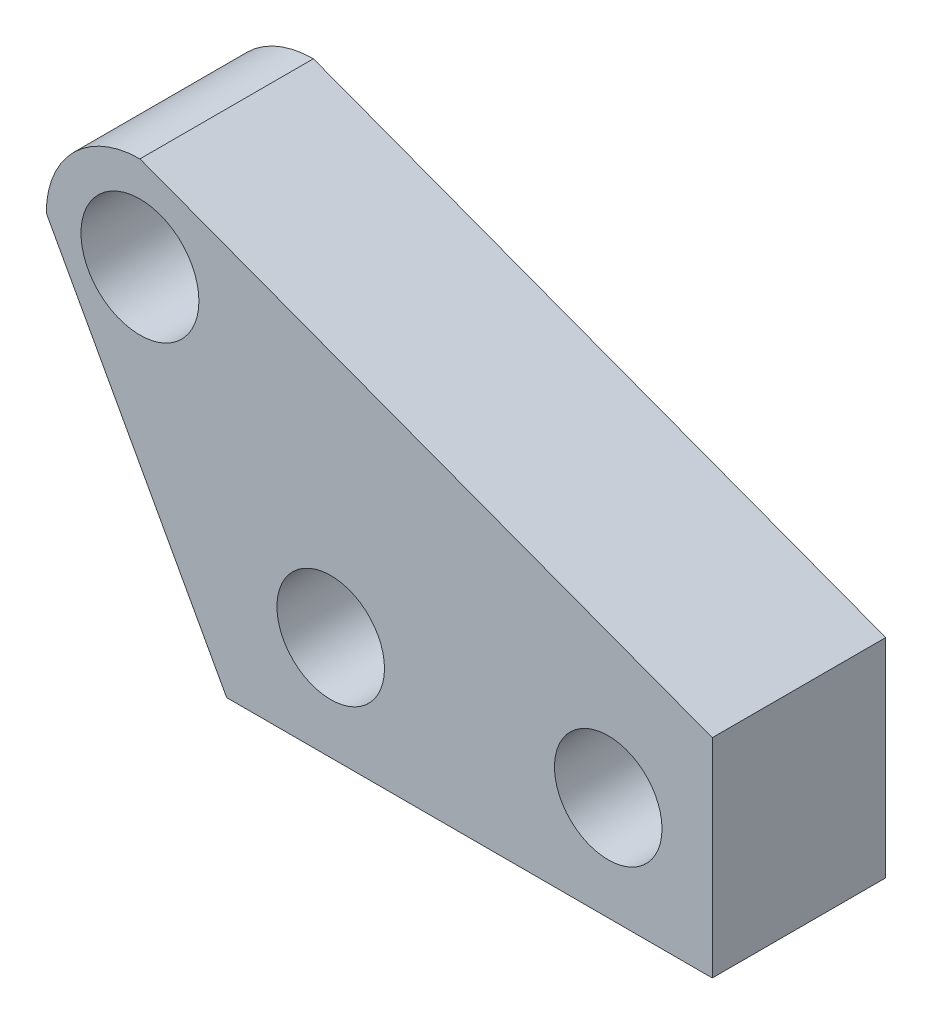
ISO-10303-21;
HEADER;
FILE_DESCRIPTION(('STEP AP214'),'2;1');
FILE_NAME('part.step','',(''),(''),'','','');
FILE_SCHEMA(('AUTOMOTIVE_DESIGN { 1 0 10303 214 1 1 1 1 }'));
ENDSEC;
DATA;
#1=APPLICATION_CONTEXT('core data for automotive mechanical design processes');
#2=APPLICATION_PROTOCOL_DEFINITION('international standard','automotive_design',2000,#1);
#3=PRODUCT_CONTEXT('',#1,'mechanical');
#4=PRODUCT('Part','Part','',(#3));
#5=PRODUCT_RELATED_PRODUCT_CATEGORY('part','',(#4));
#6=PRODUCT_DEFINITION_FORMATION('','',#4);
#7=PRODUCT_DEFINITION_CONTEXT('part definition',#1,'design');
#8=PRODUCT_DEFINITION('design','',#6,#7);
#9=PRODUCT_DEFINITION_SHAPE('','',#8);
#10=(LENGTH_UNIT() NAMED_UNIT(*) SI_UNIT(.MILLI.,.METRE.));
#11=(NAMED_UNIT(*) PLANE_ANGLE_UNIT() SI_UNIT($,.RADIAN.));
#12=(NAMED_UNIT(*) SI_UNIT($,.STERADIAN.) SOLID_ANGLE_UNIT());
#13=UNCERTAINTY_MEASURE_WITH_UNIT(LENGTH_MEASURE(1.E-05),#10,'distance_accuracy_value','');
#14=(GEOMETRIC_REPRESENTATION_CONTEXT(3) GLOBAL_UNCERTAINTY_ASSIGNED_CONTEXT((#13)) GLOBAL_UNIT_ASSIGNED_CONTEXT((#10,
#11,#12)) REPRESENTATION_CONTEXT('',''));
#15=CARTESIAN_POINT('',(0.,0.,0.));
#16=DIRECTION('',(0.,0.,1.));
#17=DIRECTION('',(1.,0.,0.));
#18=AXIS2_PLACEMENT_3D('',#15,#16,#17);
#19=CARTESIAN_POINT('',(7.,0.,5.));
#20=DIRECTION('',(-1.,0.,0.));
#21=DIRECTION('',(0.,0.,1.));
#22=AXIS2_PLACEMENT_3D('',#19,#20,#21);
#23=PLANE('',#22);
#24=DIRECTION('',(0.,1.,0.));
#25=VECTOR('',#24,1.);
#26=CARTESIAN_POINT('',(7.,0.,0.));
#27=LINE('',#26,#25);
#28=CARTESIAN_POINT('',(7.,-3.,0.));
#29=VERTEX_POINT('',#28);
#30=CARTESIAN_POINT('',(7.,3.,0.));
#31=VERTEX_POINT('',#30);
#32=EDGE_CURVE('E121',#29,#31,#27,.T.);
#33=ORIENTED_EDGE('',*,*,#32,.T.);
#34=DIRECTION('',(0.,0.,-1.));
#35=VECTOR('',#34,1.);
#36=CARTESIAN_POINT('',(7.,3.,5.));
#37=LINE('',#36,#35);
#38=CARTESIAN_POINT('',(7.,3.,5.));
#39=VERTEX_POINT('',#38);
#40=EDGE_CURVE('E11',#39,#31,#37,.T.);
#41=ORIENTED_EDGE('',*,*,#40,.F.);
#42=DIRECTION('',(0.,1.,0.));
#43=VECTOR('',#42,1.);
#44=CARTESIAN_POINT('',(7.,0.,5.));
#45=LINE('',#44,#43);
#46=CARTESIAN_POINT('',(7.,-3.,5.));
#47=VERTEX_POINT('',#46);
#48=EDGE_CURVE('E84',#47,#39,#45,.T.);
#49=ORIENTED_EDGE('',*,*,#48,.F.);
#50=DIRECTION('',(0.,0.,-1.));
#51=VECTOR('',#50,1.);
#52=CARTESIAN_POINT('',(7.,-3.,5.));
#53=LINE('',#52,#51);
#54=EDGE_CURVE('E120',#47,#29,#53,.T.);
#55=ORIENTED_EDGE('',*,*,#54,.T.);
#56=EDGE_LOOP('',(#33,#41,#49,#55));
#57=FACE_BOUND('',#56,.T.);
#58=ADVANCED_FACE('F37',(#57),#23,.F.);
#59=CARTESIAN_POINT('',(1.85387363610029,4.9336959670411,5.));
#60=DIRECTION('',(0.351745096566042,0.936095821506402,0.));
#61=DIRECTION('',(-0.936095821506402,0.351745096566042,0.));
#62=AXIS2_PLACEMENT_3D('',#59,#60,#61);
#63=PLANE('',#62);
#64=DIRECTION('',(0.936095821506402,-0.351745096566042,0.));
#65=VECTOR('',#64,1.);
#66=CARTESIAN_POINT('',(1.85387363610029,4.9336959670411,0.));
#67=LINE('',#66,#65);
#68=CARTESIAN_POINT('',(-9.5,9.2,0.));
#69=VERTEX_POINT('',#68);
#70=EDGE_CURVE('E124',#69,#31,#67,.T.);
#71=ORIENTED_EDGE('',*,*,#70,.F.);
#72=DIRECTION('',(0.,0.,-1.));
#73=VECTOR('',#72,1.);
#74=CARTESIAN_POINT('',(-9.5,9.2,5.));
#75=LINE('',#74,#73);
#76=CARTESIAN_POINT('',(-9.5,9.2,5.));
#77=VERTEX_POINT('',#76);
#78=EDGE_CURVE('E45',#77,#69,#75,.T.);
#79=ORIENTED_EDGE('',*,*,#78,.F.);
#80=DIRECTION('',(0.936095821506402,-0.351745096566042,0.));
#81=VECTOR('',#80,1.);
#82=CARTESIAN_POINT('',(1.85387363610029,4.9336959670411,5.));
#83=LINE('',#82,#81);
#84=EDGE_CURVE('E97',#77,#39,#83,.T.);
#85=ORIENTED_EDGE('',*,*,#84,.T.);
#86=ORIENTED_EDGE('',*,*,#40,.T.);
#87=EDGE_LOOP('',(#71,#79,#85,#86));
#88=FACE_BOUND('',#87,.T.);
#89=ADVANCED_FACE('F146',(#88),#63,.T.);
#90=CARTESIAN_POINT('',(-9.5,6.5,5.));
#91=DIRECTION('',(0.,0.,-1.));
#92=DIRECTION('',(-1.,0.,0.));
#93=AXIS2_PLACEMENT_3D('',#90,#91,#92);
#94=CYLINDRICAL_SURFACE('',#93,2.7);
#95=CARTESIAN_POINT('',(-9.5,6.5,0.));
#96=DIRECTION('',(0.,0.,1.));
#97=DIRECTION('',(1.,0.,0.));
#98=AXIS2_PLACEMENT_3D('',#95,#96,#97);
#99=CIRCLE('',#98,2.7);
#100=CARTESIAN_POINT('',(-12.2,6.5,0.));
#101=VERTEX_POINT('',#100);
#102=EDGE_CURVE('E103',#69,#101,#99,.T.);
#103=ORIENTED_EDGE('',*,*,#102,.T.);
#104=DIRECTION('',(0.,0.,-1.));
#105=VECTOR('',#104,1.);
#106=CARTESIAN_POINT('',(-12.2,6.5,5.));
#107=LINE('',#106,#105);
#108=CARTESIAN_POINT('',(-12.2,6.5,5.));
#109=VERTEX_POINT('',#108);
#110=EDGE_CURVE('E100',#109,#101,#107,.T.);
#111=ORIENTED_EDGE('',*,*,#110,.F.);
#112=CARTESIAN_POINT('',(-9.5,6.5,5.));
#113=DIRECTION('',(0.,0.,1.));
#114=DIRECTION('',(1.,0.,0.));
#115=AXIS2_PLACEMENT_3D('',#112,#113,#114);
#116=CIRCLE('',#115,2.7);
#117=EDGE_CURVE('E90',#77,#109,#116,.T.);
#118=ORIENTED_EDGE('',*,*,#117,.F.);
#119=ORIENTED_EDGE('',*,*,#78,.T.);
#120=EDGE_LOOP('',(#103,#111,#118,#119));
#121=FACE_BOUND('',#120,.T.);
#122=ADVANCED_FACE('F101',(#121),#94,.T.);
#123=CARTESIAN_POINT('',(-6.64975701253304,-3.63986699633387,5.));
#124=DIRECTION('',(0.877188869085252,0.480145486236138,0.));
#125=DIRECTION('',(-0.480145486236138,0.877188869085252,0.));
#126=AXIS2_PLACEMENT_3D('',#123,#124,#125);
#127=PLANE('',#126);
#128=DIRECTION('',(0.480145486236138,-0.877188869085252,0.));
#129=VECTOR('',#128,1.);
#130=CARTESIAN_POINT('',(-6.64975701253304,-3.63986699633387,0.));
#131=LINE('',#130,#129);
#132=CARTESIAN_POINT('',(-7.,-3.,0.));
#133=VERTEX_POINT('',#132);
#134=EDGE_CURVE('E72',#101,#133,#131,.T.);
#135=ORIENTED_EDGE('',*,*,#134,.T.);
#136=DIRECTION('',(0.,0.,-1.));
#137=VECTOR('',#136,1.);
#138=CARTESIAN_POINT('',(-7.,-3.,5.));
#139=LINE('',#138,#137);
#140=CARTESIAN_POINT('',(-7.,-3.,5.));
#141=VERTEX_POINT('',#140);
#142=EDGE_CURVE('E104',#141,#133,#139,.T.);
#143=ORIENTED_EDGE('',*,*,#142,.F.);
#144=DIRECTION('',(0.480145486236138,-0.877188869085252,0.));
#145=VECTOR('',#144,1.);
#146=CARTESIAN_POINT('',(-6.64975701253304,-3.63986699633387,5.));
#147=LINE('',#146,#145);
#148=EDGE_CURVE('E95',#109,#141,#147,.T.);
#149=ORIENTED_EDGE('',*,*,#148,.F.);
#150=ORIENTED_EDGE('',*,*,#110,.T.);
#151=EDGE_LOOP('',(#135,#143,#149,#150));
#152=FACE_BOUND('',#151,.T.);
#153=ADVANCED_FACE('F106',(#152),#127,.F.);
#154=CARTESIAN_POINT('',(-4.,0.,5.));
#155=DIRECTION('',(0.,0.,-1.));
#156=DIRECTION('',(-1.,0.,0.));
#157=AXIS2_PLACEMENT_3D('',#154,#155,#156);
#158=CYLINDRICAL_SURFACE('',#157,1.55);
#159=CARTESIAN_POINT('',(-4.,0.,5.));
#160=DIRECTION('',(0.,0.,1.));
#161=DIRECTION('',(1.,0.,0.));
#162=AXIS2_PLACEMENT_3D('',#159,#160,#161);
#163=CIRCLE('',#162,1.55);
#164=CARTESIAN_POINT('',(-2.45,0.,5.));
#165=VERTEX_POINT('',#164);
#166=EDGE_CURVE('E114',#165,#165,#163,.T.);
#167=ORIENTED_EDGE('',*,*,#166,.T.);
#168=EDGE_LOOP('',(#167));
#169=FACE_BOUND('',#168,.T.);
#170=CARTESIAN_POINT('',(-4.,0.,0.));
#171=DIRECTION('',(0.,0.,1.));
#172=DIRECTION('',(1.,0.,0.));
#173=AXIS2_PLACEMENT_3D('',#170,#171,#172);
#174=CIRCLE('',#173,1.55);
#175=CARTESIAN_POINT('',(-2.45,0.,0.));
#176=VERTEX_POINT('',#175);
#177=EDGE_CURVE('E133',#176,#176,#174,.T.);
#178=ORIENTED_EDGE('',*,*,#177,.F.);
#179=EDGE_LOOP('',(#178));
#180=FACE_BOUND('',#179,.T.);
#181=ADVANCED_FACE('F159',(#169,#180),#158,.F.);
#182=CARTESIAN_POINT('',(4.,0.,5.));
#183=DIRECTION('',(0.,0.,-1.));
#184=DIRECTION('',(-1.,0.,0.));
#185=AXIS2_PLACEMENT_3D('',#182,#183,#184);
#186=CYLINDRICAL_SURFACE('',#185,1.55);
#187=CARTESIAN_POINT('',(4.,0.,5.));
#188=DIRECTION('',(0.,0.,1.));
#189=DIRECTION('',(1.,0.,0.));
#190=AXIS2_PLACEMENT_3D('',#187,#188,#189);
#191=CIRCLE('',#190,1.55);
#192=CARTESIAN_POINT('',(5.55,0.,5.));
#193=VERTEX_POINT('',#192);
#194=EDGE_CURVE('E108',#193,#193,#191,.T.);
#195=ORIENTED_EDGE('',*,*,#194,.T.);
#196=EDGE_LOOP('',(#195));
#197=FACE_BOUND('',#196,.T.);
#198=CARTESIAN_POINT('',(4.,0.,0.));
#199=DIRECTION('',(0.,0.,1.));
#200=DIRECTION('',(1.,0.,0.));
#201=AXIS2_PLACEMENT_3D('',#198,#199,#200);
#202=CIRCLE('',#201,1.55);
#203=CARTESIAN_POINT('',(5.55,0.,0.));
#204=VERTEX_POINT('',#203);
#205=EDGE_CURVE('E130',#204,#204,#202,.T.);
#206=ORIENTED_EDGE('',*,*,#205,.F.);
#207=EDGE_LOOP('',(#206));
#208=FACE_BOUND('',#207,.T.);
#209=ADVANCED_FACE('F151',(#197,#208),#186,.F.);
#210=CARTESIAN_POINT('',(0.,-3.,5.));
#211=DIRECTION('',(0.,1.,0.));
#212=DIRECTION('',(0.,0.,1.));
#213=AXIS2_PLACEMENT_3D('',#210,#211,#212);
#214=PLANE('',#213);
#215=DIRECTION('',(1.,0.,0.));
#216=VECTOR('',#215,1.);
#217=CARTESIAN_POINT('',(0.,-3.,0.));
#218=LINE('',#217,#216);
#219=EDGE_CURVE('E78',#133,#29,#218,.T.);
#220=ORIENTED_EDGE('',*,*,#219,.T.);
#221=ORIENTED_EDGE('',*,*,#54,.F.);
#222=DIRECTION('',(1.,0.,0.));
#223=VECTOR('',#222,1.);
#224=CARTESIAN_POINT('',(0.,-3.,5.));
#225=LINE('',#224,#223);
#226=EDGE_CURVE('E53',#141,#47,#225,.T.);
#227=ORIENTED_EDGE('',*,*,#226,.F.);
#228=ORIENTED_EDGE('',*,*,#142,.T.);
#229=EDGE_LOOP('',(#220,#221,#227,#228));
#230=FACE_BOUND('',#229,.T.);
#231=ADVANCED_FACE('F148',(#230),#214,.F.);
#232=CARTESIAN_POINT('',(-9.5,6.5,5.));
#233=DIRECTION('',(0.,0.,-1.));
#234=DIRECTION('',(-1.,0.,0.));
#235=AXIS2_PLACEMENT_3D('',#232,#233,#234);
#236=CYLINDRICAL_SURFACE('',#235,1.7);
#237=CARTESIAN_POINT('',(-9.5,6.5,5.));
#238=DIRECTION('',(0.,0.,1.));
#239=DIRECTION('',(1.,0.,0.));
#240=AXIS2_PLACEMENT_3D('',#237,#238,#239);
#241=CIRCLE('',#240,1.7);
#242=CARTESIAN_POINT('',(-7.8,6.5,5.));
#243=VERTEX_POINT('',#242);
#244=EDGE_CURVE('E117',#243,#243,#241,.T.);
#245=ORIENTED_EDGE('',*,*,#244,.T.);
#246=EDGE_LOOP('',(#245));
#247=FACE_BOUND('',#246,.T.);
#248=CARTESIAN_POINT('',(-9.5,6.5,0.));
#249=DIRECTION('',(0.,0.,1.));
#250=DIRECTION('',(1.,0.,0.));
#251=AXIS2_PLACEMENT_3D('',#248,#249,#250);
#252=CIRCLE('',#251,1.7);
#253=CARTESIAN_POINT('',(-7.8,6.5,0.));
#254=VERTEX_POINT('',#253);
#255=EDGE_CURVE('E136',#254,#254,#252,.T.);
#256=ORIENTED_EDGE('',*,*,#255,.F.);
#257=EDGE_LOOP('',(#256));
#258=FACE_BOUND('',#257,.T.);
#259=ADVANCED_FACE('F150',(#247,#258),#236,.F.);
#260=CARTESIAN_POINT('',(0.,0.,5.));
#261=DIRECTION('',(0.,0.,1.));
#262=DIRECTION('',(1.,0.,0.));
#263=AXIS2_PLACEMENT_3D('',#260,#261,#262);
#264=PLANE('',#263);
#265=ORIENTED_EDGE('',*,*,#48,.T.);
#266=ORIENTED_EDGE('',*,*,#84,.F.);
#267=ORIENTED_EDGE('',*,*,#117,.T.);
#268=ORIENTED_EDGE('',*,*,#148,.T.);
#269=ORIENTED_EDGE('',*,*,#226,.T.);
#270=EDGE_LOOP('',(#265,#266,#267,#268,#269));
#271=FACE_BOUND('',#270,.T.);
#272=ORIENTED_EDGE('',*,*,#194,.F.);
#273=EDGE_LOOP('',(#272));
#274=FACE_BOUND('',#273,.T.);
#275=ORIENTED_EDGE('',*,*,#166,.F.);
#276=EDGE_LOOP('',(#275));
#277=FACE_BOUND('',#276,.T.);
#278=ORIENTED_EDGE('',*,*,#244,.F.);
#279=EDGE_LOOP('',(#278));
#280=FACE_BOUND('',#279,.T.);
#281=ADVANCED_FACE('F92',(#271,#274,#277,#280),#264,.T.);
#282=CARTESIAN_POINT('',(0.,0.,0.));
#283=DIRECTION('',(0.,0.,1.));
#284=DIRECTION('',(1.,0.,0.));
#285=AXIS2_PLACEMENT_3D('',#282,#283,#284);
#286=PLANE('',#285);
#287=ORIENTED_EDGE('',*,*,#32,.F.);
#288=ORIENTED_EDGE('',*,*,#219,.F.);
#289=ORIENTED_EDGE('',*,*,#134,.F.);
#290=ORIENTED_EDGE('',*,*,#102,.F.);
#291=ORIENTED_EDGE('',*,*,#70,.T.);
#292=EDGE_LOOP('',(#287,#288,#289,#290,#291));
#293=FACE_BOUND('',#292,.T.);
#294=ORIENTED_EDGE('',*,*,#205,.T.);
#295=EDGE_LOOP('',(#294));
#296=FACE_BOUND('',#295,.T.);
#297=ORIENTED_EDGE('',*,*,#177,.T.);
#298=EDGE_LOOP('',(#297));
#299=FACE_BOUND('',#298,.T.);
#300=ORIENTED_EDGE('',*,*,#255,.T.);
#301=EDGE_LOOP('',(#300));
#302=FACE_BOUND('',#301,.T.);
#303=ADVANCED_FACE('F144',(#293,#296,#299,#302),#286,.F.);
#304=CLOSED_SHELL('',(#58,#89,#122,#153,#181,#209,#231,#259,#281,#303));
#305=MANIFOLD_SOLID_BREP('B2',#304);
#306=ADVANCED_BREP_SHAPE_REPRESENTATION('',(#18,#305),#14);
#307=SHAPE_DEFINITION_REPRESENTATION(#9,#306);
ENDSEC;
END-ISO-10303-21;
